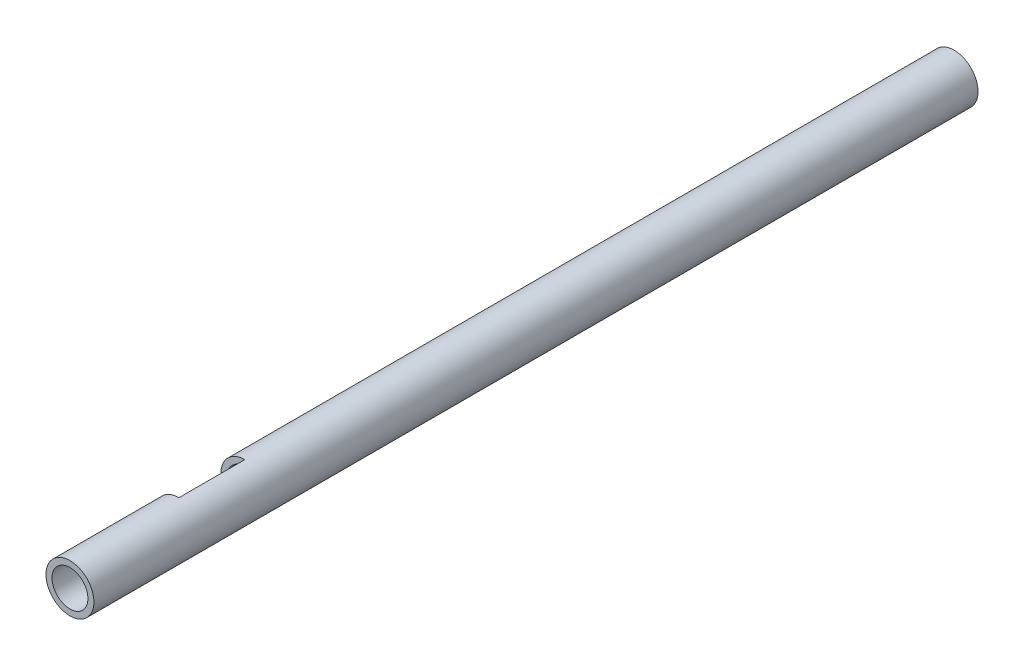
ISO-10303-21;
HEADER;
FILE_DESCRIPTION(('STEP AP214'),'2;1');
FILE_NAME('part.step','',(''),(''),'','','');
FILE_SCHEMA(('AUTOMOTIVE_DESIGN { 1 0 10303 214 1 1 1 1 }'));
ENDSEC;
DATA;
#1=APPLICATION_CONTEXT('core data for automotive mechanical design processes');
#2=APPLICATION_PROTOCOL_DEFINITION('international standard','automotive_design',2000,#1);
#3=PRODUCT_CONTEXT('',#1,'mechanical');
#4=PRODUCT('Part','Part','',(#3));
#5=PRODUCT_RELATED_PRODUCT_CATEGORY('part','',(#4));
#6=PRODUCT_DEFINITION_FORMATION('','',#4);
#7=PRODUCT_DEFINITION_CONTEXT('part definition',#1,'design');
#8=PRODUCT_DEFINITION('design','',#6,#7);
#9=PRODUCT_DEFINITION_SHAPE('','',#8);
#10=(LENGTH_UNIT() NAMED_UNIT(*) SI_UNIT(.MILLI.,.METRE.));
#11=(NAMED_UNIT(*) PLANE_ANGLE_UNIT() SI_UNIT($,.RADIAN.));
#12=(NAMED_UNIT(*) SI_UNIT($,.STERADIAN.) SOLID_ANGLE_UNIT());
#13=UNCERTAINTY_MEASURE_WITH_UNIT(LENGTH_MEASURE(1.E-05),#10,'distance_accuracy_value','');
#14=(GEOMETRIC_REPRESENTATION_CONTEXT(3) GLOBAL_UNCERTAINTY_ASSIGNED_CONTEXT((#13)) GLOBAL_UNIT_ASSIGNED_CONTEXT((#10,
#11,#12)) REPRESENTATION_CONTEXT('',''));
#15=CARTESIAN_POINT('',(0.,0.,0.));
#16=DIRECTION('',(0.,0.,1.));
#17=DIRECTION('',(1.,0.,0.));
#18=AXIS2_PLACEMENT_3D('',#15,#16,#17);
#19=CARTESIAN_POINT('',(0.,20.,0.));
#20=DIRECTION('',(0.,0.,-1.));
#21=DIRECTION('',(-1.,0.,0.));
#22=AXIS2_PLACEMENT_3D('',#19,#20,#21);
#23=PLANE('',#22);
#24=CARTESIAN_POINT('',(0.,0.,0.));
#25=DIRECTION('',(0.,0.,-1.));
#26=DIRECTION('',(-1.,0.,0.));
#27=AXIS2_PLACEMENT_3D('',#24,#25,#26);
#28=CIRCLE('',#27,20.);
#29=CARTESIAN_POINT('',(-20.,0.,0.));
#30=VERTEX_POINT('',#29);
#31=EDGE_CURVE('E103',#30,#30,#28,.T.);
#32=ORIENTED_EDGE('',*,*,#31,.T.);
#33=EDGE_LOOP('',(#32));
#34=FACE_BOUND('',#33,.T.);
#35=CARTESIAN_POINT('',(0.,0.,0.));
#36=DIRECTION('',(0.,0.,-1.));
#37=DIRECTION('',(-1.,0.,0.));
#38=AXIS2_PLACEMENT_3D('',#35,#36,#37);
#39=CIRCLE('',#38,15.);
#40=CARTESIAN_POINT('',(-15.,0.,0.));
#41=VERTEX_POINT('',#40);
#42=EDGE_CURVE('E112',#41,#41,#39,.T.);
#43=ORIENTED_EDGE('',*,*,#42,.F.);
#44=EDGE_LOOP('',(#43));
#45=FACE_BOUND('',#44,.T.);
#46=ADVANCED_FACE('F33',(#34,#45),#23,.T.);
#47=CARTESIAN_POINT('',(0.,0.,0.));
#48=DIRECTION('',(0.,0.,-1.));
#49=DIRECTION('',(-1.,0.,0.));
#50=AXIS2_PLACEMENT_3D('',#47,#48,#49);
#51=CYLINDRICAL_SURFACE('',#50,15.);
#52=CARTESIAN_POINT('',(0.,0.,592.));
#53=DIRECTION('',(0.,0.,-1.));
#54=DIRECTION('',(-1.,0.,0.));
#55=AXIS2_PLACEMENT_3D('',#52,#53,#54);
#56=CIRCLE('',#55,15.);
#57=CARTESIAN_POINT('',(0.,-15.,592.));
#58=VERTEX_POINT('',#57);
#59=CARTESIAN_POINT('',(0.,15.,592.));
#60=VERTEX_POINT('',#59);
#61=EDGE_CURVE('E75',#58,#60,#56,.T.);
#62=ORIENTED_EDGE('',*,*,#61,.F.);
#63=DIRECTION('',(0.,0.,-1.));
#64=VECTOR('',#63,1.);
#65=CARTESIAN_POINT('',(-1.18851971857251E-13,-15.,0.));
#66=LINE('',#65,#64);
#67=CARTESIAN_POINT('',(0.,-15.,647.));
#68=VERTEX_POINT('',#67);
#69=EDGE_CURVE('E100',#68,#58,#66,.T.);
#70=ORIENTED_EDGE('',*,*,#69,.F.);
#71=CARTESIAN_POINT('',(0.,0.,647.));
#72=DIRECTION('',(0.,0.,1.));
#73=DIRECTION('',(1.,0.,0.));
#74=AXIS2_PLACEMENT_3D('',#71,#72,#73);
#75=CIRCLE('',#74,15.);
#76=CARTESIAN_POINT('',(0.,15.,647.));
#77=VERTEX_POINT('',#76);
#78=EDGE_CURVE('E95',#77,#68,#75,.T.);
#79=ORIENTED_EDGE('',*,*,#78,.F.);
#80=DIRECTION('',(0.,0.,-1.));
#81=VECTOR('',#80,1.);
#82=CARTESIAN_POINT('',(-1.18851971857251E-13,15.,0.));
#83=LINE('',#82,#81);
#84=EDGE_CURVE('E98',#60,#77,#83,.F.);
#85=ORIENTED_EDGE('',*,*,#84,.F.);
#86=EDGE_LOOP('',(#62,#70,#79,#85));
#87=FACE_BOUND('',#86,.T.);
#88=ORIENTED_EDGE('',*,*,#42,.T.);
#89=EDGE_LOOP('',(#88));
#90=FACE_BOUND('',#89,.T.);
#91=CARTESIAN_POINT('',(0.,0.,738.));
#92=DIRECTION('',(0.,0.,-1.));
#93=DIRECTION('',(-1.,0.,0.));
#94=AXIS2_PLACEMENT_3D('',#91,#92,#93);
#95=CIRCLE('',#94,14.9999999999999);
#96=CARTESIAN_POINT('',(-14.9999999999999,0.,738.));
#97=VERTEX_POINT('',#96);
#98=EDGE_CURVE('E109',#97,#97,#95,.T.);
#99=ORIENTED_EDGE('',*,*,#98,.F.);
#100=EDGE_LOOP('',(#99));
#101=FACE_BOUND('',#100,.T.);
#102=ADVANCED_FACE('F119',(#87,#90,#101),#51,.F.);
#103=CARTESIAN_POINT('',(0.,19.9999999999999,738.));
#104=DIRECTION('',(0.,0.,1.));
#105=DIRECTION('',(1.,0.,0.));
#106=AXIS2_PLACEMENT_3D('',#103,#104,#105);
#107=PLANE('',#106);
#108=ORIENTED_EDGE('',*,*,#98,.T.);
#109=EDGE_LOOP('',(#108));
#110=FACE_BOUND('',#109,.T.);
#111=CARTESIAN_POINT('',(0.,0.,738.));
#112=DIRECTION('',(0.,0.,-1.));
#113=DIRECTION('',(-1.,0.,0.));
#114=AXIS2_PLACEMENT_3D('',#111,#112,#113);
#115=CIRCLE('',#114,19.9999999999999);
#116=CARTESIAN_POINT('',(-19.9999999999999,0.,738.));
#117=VERTEX_POINT('',#116);
#118=EDGE_CURVE('E106',#117,#117,#115,.T.);
#119=ORIENTED_EDGE('',*,*,#118,.F.);
#120=EDGE_LOOP('',(#119));
#121=FACE_BOUND('',#120,.T.);
#122=ADVANCED_FACE('F122',(#110,#121),#107,.T.);
#123=CARTESIAN_POINT('',(0.,0.,0.));
#124=DIRECTION('',(0.,0.,-1.));
#125=DIRECTION('',(-1.,0.,0.));
#126=AXIS2_PLACEMENT_3D('',#123,#124,#125);
#127=CYLINDRICAL_SURFACE('',#126,20.);
#128=CARTESIAN_POINT('',(0.,0.,592.));
#129=DIRECTION('',(0.,0.,-1.));
#130=DIRECTION('',(-1.,0.,0.));
#131=AXIS2_PLACEMENT_3D('',#128,#129,#130);
#132=CIRCLE('',#131,20.);
#133=CARTESIAN_POINT('',(0.,20.,592.));
#134=VERTEX_POINT('',#133);
#135=CARTESIAN_POINT('',(0.,-20.,592.));
#136=VERTEX_POINT('',#135);
#137=EDGE_CURVE('E11',#134,#136,#132,.F.);
#138=ORIENTED_EDGE('',*,*,#137,.F.);
#139=DIRECTION('',(0.,0.,-1.));
#140=VECTOR('',#139,1.);
#141=CARTESIAN_POINT('',(0.,20.,592.));
#142=LINE('',#141,#140);
#143=CARTESIAN_POINT('',(0.,20.,647.));
#144=VERTEX_POINT('',#143);
#145=EDGE_CURVE('E81',#144,#134,#142,.T.);
#146=ORIENTED_EDGE('',*,*,#145,.F.);
#147=CARTESIAN_POINT('',(0.,0.,647.));
#148=DIRECTION('',(0.,0.,1.));
#149=DIRECTION('',(1.,0.,0.));
#150=AXIS2_PLACEMENT_3D('',#147,#148,#149);
#151=CIRCLE('',#150,20.);
#152=CARTESIAN_POINT('',(0.,-20.,647.));
#153=VERTEX_POINT('',#152);
#154=EDGE_CURVE('E40',#153,#144,#151,.F.);
#155=ORIENTED_EDGE('',*,*,#154,.F.);
#156=DIRECTION('',(0.,0.,-1.));
#157=VECTOR('',#156,1.);
#158=CARTESIAN_POINT('',(0.,-20.,592.));
#159=LINE('',#158,#157);
#160=EDGE_CURVE('E85',#153,#136,#159,.T.);
#161=ORIENTED_EDGE('',*,*,#160,.T.);
#162=EDGE_LOOP('',(#138,#146,#155,#161));
#163=FACE_BOUND('',#162,.T.);
#164=ORIENTED_EDGE('',*,*,#118,.T.);
#165=EDGE_LOOP('',(#164));
#166=FACE_BOUND('',#165,.T.);
#167=ORIENTED_EDGE('',*,*,#31,.F.);
#168=EDGE_LOOP('',(#167));
#169=FACE_BOUND('',#168,.T.);
#170=ADVANCED_FACE('F88',(#163,#166,#169),#127,.T.);
#171=CARTESIAN_POINT('',(0.,-20.,592.));
#172=DIRECTION('',(1.,0.,0.));
#173=DIRECTION('',(0.,0.,-1.));
#174=AXIS2_PLACEMENT_3D('',#171,#172,#173);
#175=PLANE('',#174);
#176=ORIENTED_EDGE('',*,*,#69,.T.);
#177=DIRECTION('',(0.,1.,0.));
#178=VECTOR('',#177,1.);
#179=CARTESIAN_POINT('',(0.,-20.,592.));
#180=LINE('',#179,#178);
#181=EDGE_CURVE('E77',#136,#58,#180,.T.);
#182=ORIENTED_EDGE('',*,*,#181,.F.);
#183=ORIENTED_EDGE('',*,*,#160,.F.);
#184=DIRECTION('',(0.,1.,0.));
#185=VECTOR('',#184,1.);
#186=CARTESIAN_POINT('',(0.,-20.,647.));
#187=LINE('',#186,#185);
#188=EDGE_CURVE('E78',#153,#68,#187,.T.);
#189=ORIENTED_EDGE('',*,*,#188,.T.);
#190=EDGE_LOOP('',(#176,#182,#183,#189));
#191=FACE_BOUND('',#190,.T.);
#192=ADVANCED_FACE('F117',(#191),#175,.F.);
#193=CARTESIAN_POINT('',(-37.7147515339686,-20.,592.));
#194=DIRECTION('',(0.,0.,-1.));
#195=DIRECTION('',(-1.,0.,0.));
#196=AXIS2_PLACEMENT_3D('',#193,#194,#195);
#197=PLANE('',#196);
#198=ORIENTED_EDGE('',*,*,#61,.T.);
#199=EDGE_CURVE('E69',#60,#134,#180,.T.);
#200=ORIENTED_EDGE('',*,*,#199,.T.);
#201=ORIENTED_EDGE('',*,*,#137,.T.);
#202=ORIENTED_EDGE('',*,*,#181,.T.);
#203=EDGE_LOOP('',(#198,#200,#201,#202));
#204=FACE_BOUND('',#203,.T.);
#205=ADVANCED_FACE('F70',(#204),#197,.F.);
#206=ORIENTED_EDGE('',*,*,#84,.T.);
#207=EDGE_CURVE('E47',#77,#144,#187,.T.);
#208=ORIENTED_EDGE('',*,*,#207,.T.);
#209=ORIENTED_EDGE('',*,*,#145,.T.);
#210=ORIENTED_EDGE('',*,*,#199,.F.);
#211=EDGE_LOOP('',(#206,#208,#209,#210));
#212=FACE_BOUND('',#211,.T.);
#213=ADVANCED_FACE('F82',(#212),#175,.F.);
#214=CARTESIAN_POINT('',(-37.7147515339686,-20.,647.));
#215=DIRECTION('',(0.,0.,1.));
#216=DIRECTION('',(1.,0.,0.));
#217=AXIS2_PLACEMENT_3D('',#214,#215,#216);
#218=PLANE('',#217);
#219=ORIENTED_EDGE('',*,*,#78,.T.);
#220=ORIENTED_EDGE('',*,*,#188,.F.);
#221=ORIENTED_EDGE('',*,*,#154,.T.);
#222=ORIENTED_EDGE('',*,*,#207,.F.);
#223=EDGE_LOOP('',(#219,#220,#221,#222));
#224=FACE_BOUND('',#223,.T.);
#225=ADVANCED_FACE('F114',(#224),#218,.F.);
#226=CLOSED_SHELL('',(#46,#102,#122,#170,#192,#205,#213,#225));
#227=MANIFOLD_SOLID_BREP('B2',#226);
#228=ADVANCED_BREP_SHAPE_REPRESENTATION('',(#18,#227),#14);
#229=SHAPE_DEFINITION_REPRESENTATION(#9,#228);
ENDSEC;
END-ISO-10303-21;
